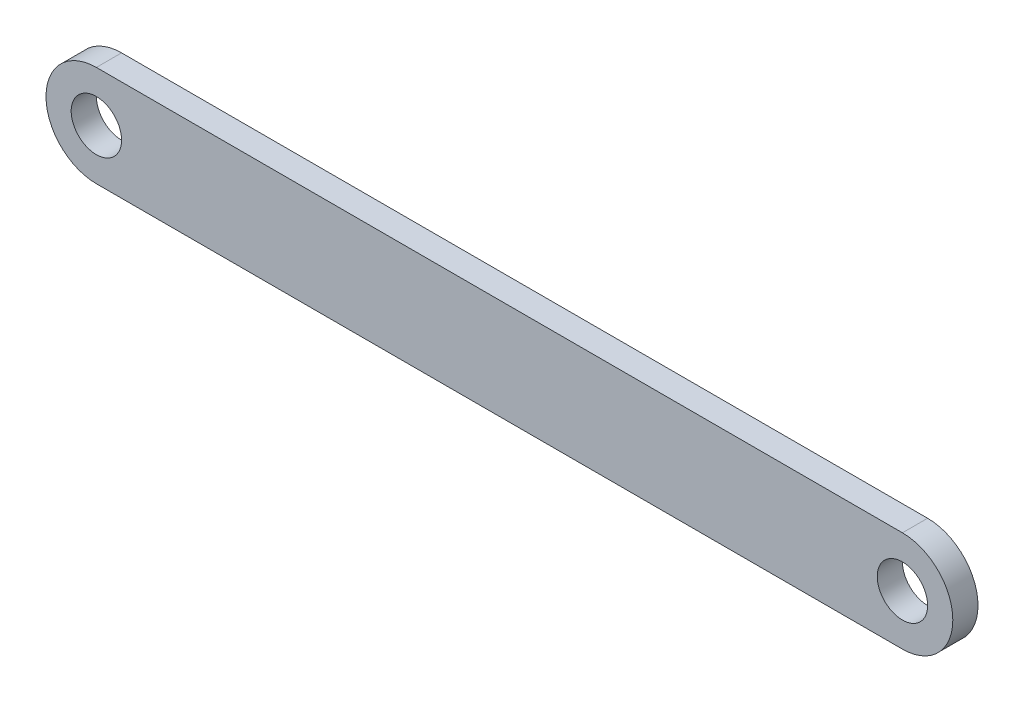
ISO-10303-21;
HEADER;
FILE_DESCRIPTION(('STEP AP214'),'2;1');
FILE_NAME('part.step','',(''),(''),'','','');
FILE_SCHEMA(('AUTOMOTIVE_DESIGN { 1 0 10303 214 1 1 1 1 }'));
ENDSEC;
DATA;
#1=APPLICATION_CONTEXT('core data for automotive mechanical design processes');
#2=APPLICATION_PROTOCOL_DEFINITION('international standard','automotive_design',2000,#1);
#3=PRODUCT_CONTEXT('',#1,'mechanical');
#4=PRODUCT('Part','Part','',(#3));
#5=PRODUCT_RELATED_PRODUCT_CATEGORY('part','',(#4));
#6=PRODUCT_DEFINITION_FORMATION('','',#4);
#7=PRODUCT_DEFINITION_CONTEXT('part definition',#1,'design');
#8=PRODUCT_DEFINITION('design','',#6,#7);
#9=PRODUCT_DEFINITION_SHAPE('','',#8);
#10=(LENGTH_UNIT() NAMED_UNIT(*) SI_UNIT(.MILLI.,.METRE.));
#11=(NAMED_UNIT(*) PLANE_ANGLE_UNIT() SI_UNIT($,.RADIAN.));
#12=(NAMED_UNIT(*) SI_UNIT($,.STERADIAN.) SOLID_ANGLE_UNIT());
#13=UNCERTAINTY_MEASURE_WITH_UNIT(LENGTH_MEASURE(1.E-05),#10,'distance_accuracy_value','');
#14=(GEOMETRIC_REPRESENTATION_CONTEXT(3) GLOBAL_UNCERTAINTY_ASSIGNED_CONTEXT((#13)) GLOBAL_UNIT_ASSIGNED_CONTEXT((#10,
#11,#12)) REPRESENTATION_CONTEXT('',''));
#15=CARTESIAN_POINT('',(0.,0.,0.));
#16=DIRECTION('',(0.,0.,1.));
#17=DIRECTION('',(1.,0.,0.));
#18=AXIS2_PLACEMENT_3D('',#15,#16,#17);
#19=CARTESIAN_POINT('',(-38.6981539199233,2.88659793814433,5.));
#20=DIRECTION('',(0.,0.,1.));
#21=DIRECTION('',(1.,0.,0.));
#22=AXIS2_PLACEMENT_3D('',#19,#20,#21);
#23=PLANE('',#22);
#24=CARTESIAN_POINT('',(-38.6981539199233,2.88659793814433,5.));
#25=DIRECTION('',(0.,0.,1.));
#26=DIRECTION('',(1.,0.,0.));
#27=AXIS2_PLACEMENT_3D('',#24,#25,#26);
#28=CIRCLE('',#27,5.);
#29=CARTESIAN_POINT('',(-33.6981539199233,2.88659793814433,5.));
#30=VERTEX_POINT('',#29);
#31=EDGE_CURVE('E106',#30,#30,#28,.T.);
#32=ORIENTED_EDGE('',*,*,#31,.F.);
#33=EDGE_LOOP('',(#32));
#34=FACE_BOUND('',#33,.T.);
#35=CARTESIAN_POINT('',(-38.6981539199233,2.88659793814433,5.));
#36=DIRECTION('',(0.,0.,1.));
#37=DIRECTION('',(1.,0.,0.));
#38=AXIS2_PLACEMENT_3D('',#35,#36,#37);
#39=CIRCLE('',#38,10.);
#40=CARTESIAN_POINT('',(-38.6981539199233,12.8865979381443,5.));
#41=VERTEX_POINT('',#40);
#42=CARTESIAN_POINT('',(-38.6981539199233,-7.11340206185567,5.));
#43=VERTEX_POINT('',#42);
#44=EDGE_CURVE('E91',#41,#43,#39,.T.);
#45=ORIENTED_EDGE('',*,*,#44,.T.);
#46=DIRECTION('',(1.,0.,0.));
#47=VECTOR('',#46,1.);
#48=CARTESIAN_POINT('',(-38.6981539199233,-7.11340206185567,5.));
#49=LINE('',#48,#47);
#50=CARTESIAN_POINT('',(121.301846080077,-7.11340206185567,5.));
#51=VERTEX_POINT('',#50);
#52=EDGE_CURVE('E86',#43,#51,#49,.T.);
#53=ORIENTED_EDGE('',*,*,#52,.T.);
#54=CARTESIAN_POINT('',(121.301846080077,2.88659793814433,5.));
#55=DIRECTION('',(0.,0.,1.));
#56=DIRECTION('',(1.,0.,0.));
#57=AXIS2_PLACEMENT_3D('',#54,#55,#56);
#58=CIRCLE('',#57,10.);
#59=CARTESIAN_POINT('',(121.301846080077,12.8865979381443,5.));
#60=VERTEX_POINT('',#59);
#61=EDGE_CURVE('E89',#51,#60,#58,.T.);
#62=ORIENTED_EDGE('',*,*,#61,.T.);
#63=DIRECTION('',(-1.,0.,0.));
#64=VECTOR('',#63,1.);
#65=CARTESIAN_POINT('',(-38.6981539199233,12.8865979381443,5.));
#66=LINE('',#65,#64);
#67=EDGE_CURVE('E56',#60,#41,#66,.T.);
#68=ORIENTED_EDGE('',*,*,#67,.T.);
#69=EDGE_LOOP('',(#45,#53,#62,#68));
#70=FACE_BOUND('',#69,.T.);
#71=CARTESIAN_POINT('',(121.301846080077,2.88659793814433,5.));
#72=DIRECTION('',(0.,0.,1.));
#73=DIRECTION('',(1.,0.,0.));
#74=AXIS2_PLACEMENT_3D('',#71,#72,#73);
#75=CIRCLE('',#74,5.00000000000002);
#76=CARTESIAN_POINT('',(126.301846080077,2.88659793814433,5.));
#77=VERTEX_POINT('',#76);
#78=EDGE_CURVE('E121',#77,#77,#75,.T.);
#79=ORIENTED_EDGE('',*,*,#78,.F.);
#80=EDGE_LOOP('',(#79));
#81=FACE_BOUND('',#80,.T.);
#82=ADVANCED_FACE('F39',(#34,#70,#81),#23,.T.);
#83=CARTESIAN_POINT('',(-38.6981539199233,2.88659793814433,0.));
#84=DIRECTION('',(0.,0.,1.));
#85=DIRECTION('',(1.,0.,0.));
#86=AXIS2_PLACEMENT_3D('',#83,#84,#85);
#87=PLANE('',#86);
#88=CARTESIAN_POINT('',(-38.6981539199233,2.88659793814433,0.));
#89=DIRECTION('',(0.,0.,1.));
#90=DIRECTION('',(1.,0.,0.));
#91=AXIS2_PLACEMENT_3D('',#88,#89,#90);
#92=CIRCLE('',#91,10.);
#93=CARTESIAN_POINT('',(-38.6981539199233,12.8865979381443,0.));
#94=VERTEX_POINT('',#93);
#95=CARTESIAN_POINT('',(-38.6981539199233,-7.11340206185567,0.));
#96=VERTEX_POINT('',#95);
#97=EDGE_CURVE('E103',#94,#96,#92,.T.);
#98=ORIENTED_EDGE('',*,*,#97,.F.);
#99=DIRECTION('',(-1.,0.,0.));
#100=VECTOR('',#99,1.);
#101=CARTESIAN_POINT('',(-38.6981539199233,12.8865979381443,0.));
#102=LINE('',#101,#100);
#103=CARTESIAN_POINT('',(121.301846080077,12.8865979381443,0.));
#104=VERTEX_POINT('',#103);
#105=EDGE_CURVE('E79',#104,#94,#102,.T.);
#106=ORIENTED_EDGE('',*,*,#105,.F.);
#107=CARTESIAN_POINT('',(121.301846080077,2.88659793814433,0.));
#108=DIRECTION('',(0.,0.,1.));
#109=DIRECTION('',(1.,0.,0.));
#110=AXIS2_PLACEMENT_3D('',#107,#108,#109);
#111=CIRCLE('',#110,10.);
#112=CARTESIAN_POINT('',(121.301846080077,-7.11340206185567,0.));
#113=VERTEX_POINT('',#112);
#114=EDGE_CURVE('E73',#113,#104,#111,.T.);
#115=ORIENTED_EDGE('',*,*,#114,.F.);
#116=DIRECTION('',(1.,0.,0.));
#117=VECTOR('',#116,1.);
#118=CARTESIAN_POINT('',(-38.6981539199233,-7.11340206185567,0.));
#119=LINE('',#118,#117);
#120=EDGE_CURVE('E95',#96,#113,#119,.T.);
#121=ORIENTED_EDGE('',*,*,#120,.F.);
#122=EDGE_LOOP('',(#98,#106,#115,#121));
#123=FACE_BOUND('',#122,.T.);
#124=CARTESIAN_POINT('',(-38.6981539199233,2.88659793814433,0.));
#125=DIRECTION('',(0.,0.,1.));
#126=DIRECTION('',(1.,0.,0.));
#127=AXIS2_PLACEMENT_3D('',#124,#125,#126);
#128=CIRCLE('',#127,5.);
#129=CARTESIAN_POINT('',(-33.6981539199233,2.88659793814433,0.));
#130=VERTEX_POINT('',#129);
#131=EDGE_CURVE('E118',#130,#130,#128,.T.);
#132=ORIENTED_EDGE('',*,*,#131,.T.);
#133=EDGE_LOOP('',(#132));
#134=FACE_BOUND('',#133,.T.);
#135=CARTESIAN_POINT('',(121.301846080077,2.88659793814433,0.));
#136=DIRECTION('',(0.,0.,1.));
#137=DIRECTION('',(1.,0.,0.));
#138=AXIS2_PLACEMENT_3D('',#135,#136,#137);
#139=CIRCLE('',#138,5.00000000000002);
#140=CARTESIAN_POINT('',(126.301846080077,2.88659793814433,0.));
#141=VERTEX_POINT('',#140);
#142=EDGE_CURVE('E124',#141,#141,#139,.T.);
#143=ORIENTED_EDGE('',*,*,#142,.T.);
#144=EDGE_LOOP('',(#143));
#145=FACE_BOUND('',#144,.T.);
#146=ADVANCED_FACE('F114',(#123,#134,#145),#87,.F.);
#147=CARTESIAN_POINT('',(-38.6981539199233,2.88659793814433,5.));
#148=DIRECTION('',(0.,0.,-1.));
#149=DIRECTION('',(-1.,0.,0.));
#150=AXIS2_PLACEMENT_3D('',#147,#148,#149);
#151=CYLINDRICAL_SURFACE('',#150,10.);
#152=ORIENTED_EDGE('',*,*,#97,.T.);
#153=DIRECTION('',(0.,0.,-1.));
#154=VECTOR('',#153,1.);
#155=CARTESIAN_POINT('',(-38.6981539199233,-7.11340206185567,5.));
#156=LINE('',#155,#154);
#157=EDGE_CURVE('E11',#43,#96,#156,.T.);
#158=ORIENTED_EDGE('',*,*,#157,.F.);
#159=ORIENTED_EDGE('',*,*,#44,.F.);
#160=DIRECTION('',(0.,0.,-1.));
#161=VECTOR('',#160,1.);
#162=CARTESIAN_POINT('',(-38.6981539199233,12.8865979381443,5.));
#163=LINE('',#162,#161);
#164=EDGE_CURVE('E99',#41,#94,#163,.T.);
#165=ORIENTED_EDGE('',*,*,#164,.T.);
#166=EDGE_LOOP('',(#152,#158,#159,#165));
#167=FACE_BOUND('',#166,.T.);
#168=ADVANCED_FACE('F41',(#167),#151,.T.);
#169=CARTESIAN_POINT('',(-38.6981539199233,-7.11340206185567,5.));
#170=DIRECTION('',(0.,1.,0.));
#171=DIRECTION('',(-1.,0.,0.));
#172=AXIS2_PLACEMENT_3D('',#169,#170,#171);
#173=PLANE('',#172);
#174=ORIENTED_EDGE('',*,*,#120,.T.);
#175=DIRECTION('',(0.,0.,-1.));
#176=VECTOR('',#175,1.);
#177=CARTESIAN_POINT('',(121.301846080077,-7.11340206185567,5.));
#178=LINE('',#177,#176);
#179=EDGE_CURVE('E48',#51,#113,#178,.T.);
#180=ORIENTED_EDGE('',*,*,#179,.F.);
#181=ORIENTED_EDGE('',*,*,#52,.F.);
#182=ORIENTED_EDGE('',*,*,#157,.T.);
#183=EDGE_LOOP('',(#174,#180,#181,#182));
#184=FACE_BOUND('',#183,.T.);
#185=ADVANCED_FACE('F94',(#184),#173,.F.);
#186=CARTESIAN_POINT('',(121.301846080077,2.88659793814433,5.));
#187=DIRECTION('',(0.,0.,-1.));
#188=DIRECTION('',(-1.,0.,0.));
#189=AXIS2_PLACEMENT_3D('',#186,#187,#188);
#190=CYLINDRICAL_SURFACE('',#189,10.);
#191=ORIENTED_EDGE('',*,*,#114,.T.);
#192=DIRECTION('',(0.,0.,-1.));
#193=VECTOR('',#192,1.);
#194=CARTESIAN_POINT('',(121.301846080077,12.8865979381443,5.));
#195=LINE('',#194,#193);
#196=EDGE_CURVE('E96',#60,#104,#195,.T.);
#197=ORIENTED_EDGE('',*,*,#196,.F.);
#198=ORIENTED_EDGE('',*,*,#61,.F.);
#199=ORIENTED_EDGE('',*,*,#179,.T.);
#200=EDGE_LOOP('',(#191,#197,#198,#199));
#201=FACE_BOUND('',#200,.T.);
#202=ADVANCED_FACE('F97',(#201),#190,.T.);
#203=CARTESIAN_POINT('',(-38.6981539199233,12.8865979381443,5.));
#204=DIRECTION('',(0.,-1.,0.));
#205=DIRECTION('',(0.,0.,-1.));
#206=AXIS2_PLACEMENT_3D('',#203,#204,#205);
#207=PLANE('',#206);
#208=ORIENTED_EDGE('',*,*,#105,.T.);
#209=ORIENTED_EDGE('',*,*,#164,.F.);
#210=ORIENTED_EDGE('',*,*,#67,.F.);
#211=ORIENTED_EDGE('',*,*,#196,.T.);
#212=EDGE_LOOP('',(#208,#209,#210,#211));
#213=FACE_BOUND('',#212,.T.);
#214=ADVANCED_FACE('F111',(#213),#207,.F.);
#215=CARTESIAN_POINT('',(-38.6981539199233,2.88659793814433,5.));
#216=DIRECTION('',(0.,0.,-1.));
#217=DIRECTION('',(-1.,0.,0.));
#218=AXIS2_PLACEMENT_3D('',#215,#216,#217);
#219=CYLINDRICAL_SURFACE('',#218,5.);
#220=ORIENTED_EDGE('',*,*,#31,.T.);
#221=EDGE_LOOP('',(#220));
#222=FACE_BOUND('',#221,.T.);
#223=ORIENTED_EDGE('',*,*,#131,.F.);
#224=EDGE_LOOP('',(#223));
#225=FACE_BOUND('',#224,.T.);
#226=ADVANCED_FACE('F141',(#222,#225),#219,.F.);
#227=CARTESIAN_POINT('',(121.301846080077,2.88659793814433,5.));
#228=DIRECTION('',(0.,0.,-1.));
#229=DIRECTION('',(-1.,0.,0.));
#230=AXIS2_PLACEMENT_3D('',#227,#228,#229);
#231=CYLINDRICAL_SURFACE('',#230,5.00000000000002);
#232=ORIENTED_EDGE('',*,*,#78,.T.);
#233=EDGE_LOOP('',(#232));
#234=FACE_BOUND('',#233,.T.);
#235=ORIENTED_EDGE('',*,*,#142,.F.);
#236=EDGE_LOOP('',(#235));
#237=FACE_BOUND('',#236,.T.);
#238=ADVANCED_FACE('F130',(#234,#237),#231,.F.);
#239=CLOSED_SHELL('',(#82,#146,#168,#185,#202,#214,#226,#238));
#240=MANIFOLD_SOLID_BREP('B2',#239);
#241=ADVANCED_BREP_SHAPE_REPRESENTATION('',(#18,#240),#14);
#242=SHAPE_DEFINITION_REPRESENTATION(#9,#241);
ENDSEC;
END-ISO-10303-21;
